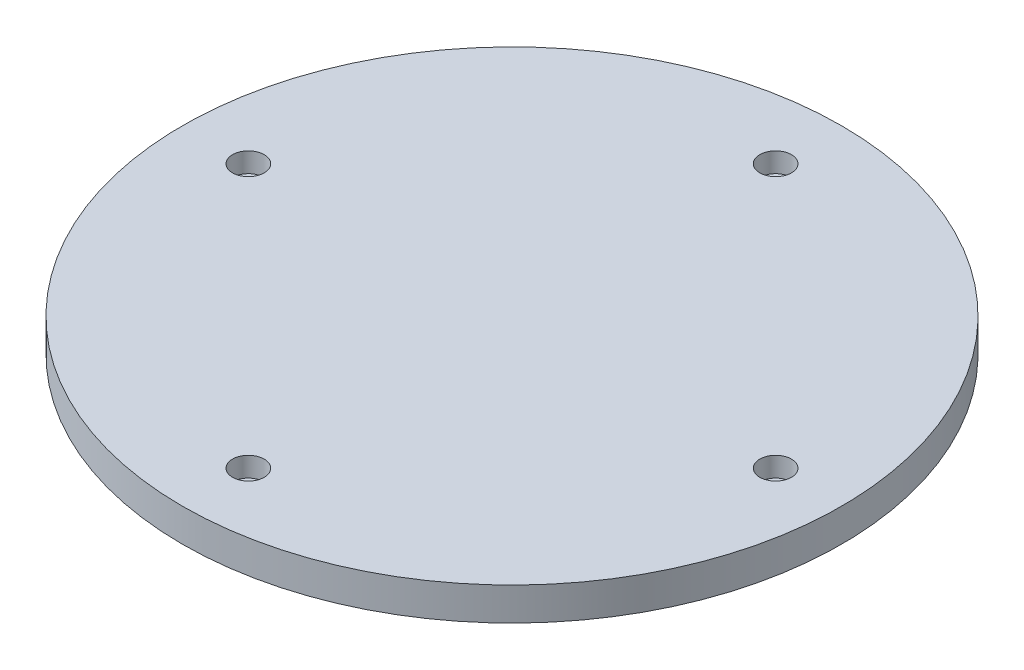
ISO-10303-21;
HEADER;
FILE_DESCRIPTION(('STEP AP214'),'2;1');
FILE_NAME('part.step','',(''),(''),'','','');
FILE_SCHEMA(('AUTOMOTIVE_DESIGN { 1 0 10303 214 1 1 1 1 }'));
ENDSEC;
DATA;
#1=APPLICATION_CONTEXT('core data for automotive mechanical design processes');
#2=APPLICATION_PROTOCOL_DEFINITION('international standard','automotive_design',2000,#1);
#3=PRODUCT_CONTEXT('',#1,'mechanical');
#4=PRODUCT('Part','Part','',(#3));
#5=PRODUCT_RELATED_PRODUCT_CATEGORY('part','',(#4));
#6=PRODUCT_DEFINITION_FORMATION('','',#4);
#7=PRODUCT_DEFINITION_CONTEXT('part definition',#1,'design');
#8=PRODUCT_DEFINITION('design','',#6,#7);
#9=PRODUCT_DEFINITION_SHAPE('','',#8);
#10=(LENGTH_UNIT() NAMED_UNIT(*) SI_UNIT(.MILLI.,.METRE.));
#11=(NAMED_UNIT(*) PLANE_ANGLE_UNIT() SI_UNIT($,.RADIAN.));
#12=(NAMED_UNIT(*) SI_UNIT($,.STERADIAN.) SOLID_ANGLE_UNIT());
#13=UNCERTAINTY_MEASURE_WITH_UNIT(LENGTH_MEASURE(1.E-05),#10,'distance_accuracy_value','');
#14=(GEOMETRIC_REPRESENTATION_CONTEXT(3) GLOBAL_UNCERTAINTY_ASSIGNED_CONTEXT((#13)) GLOBAL_UNIT_ASSIGNED_CONTEXT((#10,
#11,#12)) REPRESENTATION_CONTEXT('',''));
#15=CARTESIAN_POINT('',(0.,0.,0.));
#16=DIRECTION('',(0.,0.,1.));
#17=DIRECTION('',(1.,0.,0.));
#18=AXIS2_PLACEMENT_3D('',#15,#16,#17);
#19=CARTESIAN_POINT('',(0.,5.,0.));
#20=DIRECTION('',(0.,-1.,0.));
#21=DIRECTION('',(0.,0.,-1.));
#22=AXIS2_PLACEMENT_3D('',#19,#20,#21);
#23=CYLINDRICAL_SURFACE('',#22,50.);
#24=CARTESIAN_POINT('',(0.,5.,0.));
#25=DIRECTION('',(0.,1.,0.));
#26=DIRECTION('',(0.,0.,1.));
#27=AXIS2_PLACEMENT_3D('',#24,#25,#26);
#28=CIRCLE('',#27,50.);
#29=CARTESIAN_POINT('',(0.,5.,50.));
#30=VERTEX_POINT('',#29);
#31=EDGE_CURVE('E10',#30,#30,#28,.T.);
#32=ORIENTED_EDGE('',*,*,#31,.F.);
#33=EDGE_LOOP('',(#32));
#34=FACE_BOUND('',#33,.T.);
#35=CARTESIAN_POINT('',(0.,0.,0.));
#36=DIRECTION('',(0.,1.,0.));
#37=DIRECTION('',(0.,0.,1.));
#38=AXIS2_PLACEMENT_3D('',#35,#36,#37);
#39=CIRCLE('',#38,50.);
#40=CARTESIAN_POINT('',(0.,0.,50.));
#41=VERTEX_POINT('',#40);
#42=EDGE_CURVE('E38',#41,#41,#39,.T.);
#43=ORIENTED_EDGE('',*,*,#42,.T.);
#44=EDGE_LOOP('',(#43));
#45=FACE_BOUND('',#44,.T.);
#46=ADVANCED_FACE('F35',(#34,#45),#23,.T.);
#47=CARTESIAN_POINT('',(0.,5.,0.));
#48=DIRECTION('',(0.,1.,0.));
#49=DIRECTION('',(0.,0.,1.));
#50=AXIS2_PLACEMENT_3D('',#47,#48,#49);
#51=PLANE('',#50);
#52=CARTESIAN_POINT('',(0.,5.,-40.));
#53=DIRECTION('',(0.,1.,0.));
#54=DIRECTION('',(0.,0.,1.));
#55=AXIS2_PLACEMENT_3D('',#52,#53,#54);
#56=CIRCLE('',#55,2.4);
#57=CARTESIAN_POINT('',(0.,5.,-37.6));
#58=VERTEX_POINT('',#57);
#59=EDGE_CURVE('E101',#58,#58,#56,.T.);
#60=ORIENTED_EDGE('',*,*,#59,.F.);
#61=EDGE_LOOP('',(#60));
#62=FACE_BOUND('',#61,.T.);
#63=CARTESIAN_POINT('',(40.0000000000011,5.,-1.12952049642128E-12));
#64=DIRECTION('',(0.,1.,0.));
#65=DIRECTION('',(0.,0.,1.));
#66=AXIS2_PLACEMENT_3D('',#63,#64,#65);
#67=CIRCLE('',#66,2.40000000000088);
#68=CARTESIAN_POINT('',(40.0000000000011,5.,2.39999999999975));
#69=VERTEX_POINT('',#68);
#70=EDGE_CURVE('E98',#69,#69,#67,.T.);
#71=ORIENTED_EDGE('',*,*,#70,.F.);
#72=EDGE_LOOP('',(#71));
#73=FACE_BOUND('',#72,.T.);
#74=CARTESIAN_POINT('',(2.25904099284255E-12,5.,40.));
#75=DIRECTION('',(0.,1.,0.));
#76=DIRECTION('',(0.,0.,1.));
#77=AXIS2_PLACEMENT_3D('',#74,#75,#76);
#78=CIRCLE('',#77,2.40000000000243);
#79=CARTESIAN_POINT('',(2.25904099284255E-12,5.,42.4000000000024));
#80=VERTEX_POINT('',#79);
#81=EDGE_CURVE('E92',#80,#80,#78,.T.);
#82=ORIENTED_EDGE('',*,*,#81,.F.);
#83=EDGE_LOOP('',(#82));
#84=FACE_BOUND('',#83,.T.);
#85=CARTESIAN_POINT('',(-39.9999999999989,5.,1.13441908361787E-12));
#86=DIRECTION('',(0.,1.,0.));
#87=DIRECTION('',(0.,0.,1.));
#88=AXIS2_PLACEMENT_3D('',#85,#86,#87);
#89=CIRCLE('',#88,2.40000000000181);
#90=CARTESIAN_POINT('',(-39.9999999999989,5.,2.40000000000295));
#91=VERTEX_POINT('',#90);
#92=EDGE_CURVE('E86',#91,#91,#89,.T.);
#93=ORIENTED_EDGE('',*,*,#92,.F.);
#94=EDGE_LOOP('',(#93));
#95=FACE_BOUND('',#94,.T.);
#96=ORIENTED_EDGE('',*,*,#31,.T.);
#97=EDGE_LOOP('',(#96));
#98=FACE_BOUND('',#97,.T.);
#99=ADVANCED_FACE('F116',(#62,#73,#84,#95,#98),#51,.T.);
#100=CARTESIAN_POINT('',(0.,0.,0.));
#101=DIRECTION('',(0.,1.,0.));
#102=DIRECTION('',(0.,0.,1.));
#103=AXIS2_PLACEMENT_3D('',#100,#101,#102);
#104=PLANE('',#103);
#105=CARTESIAN_POINT('',(-8.00000000000014,0.,13.8564064605505));
#106=DIRECTION('',(0.,-1.,0.));
#107=DIRECTION('',(0.,0.,-1.));
#108=AXIS2_PLACEMENT_3D('',#105,#106,#107);
#109=CIRCLE('',#108,2.25);
#110=CARTESIAN_POINT('',(-8.00000000000014,0.,11.6064064605505));
#111=VERTEX_POINT('',#110);
#112=EDGE_CURVE('E56',#111,#111,#109,.T.);
#113=ORIENTED_EDGE('',*,*,#112,.F.);
#114=EDGE_LOOP('',(#113));
#115=FACE_BOUND('',#114,.T.);
#116=CARTESIAN_POINT('',(-15.9999999999996,0.,-8.38426233764199E-13));
#117=DIRECTION('',(0.,-1.,0.));
#118=DIRECTION('',(0.,0.,-1.));
#119=AXIS2_PLACEMENT_3D('',#116,#117,#118);
#120=CIRCLE('',#119,2.25);
#121=CARTESIAN_POINT('',(-15.9999999999996,0.,-2.25000000000084));
#122=VERTEX_POINT('',#121);
#123=EDGE_CURVE('E63',#122,#122,#120,.T.);
#124=ORIENTED_EDGE('',*,*,#123,.F.);
#125=EDGE_LOOP('',(#124));
#126=FACE_BOUND('',#125,.T.);
#127=CARTESIAN_POINT('',(-7.99999999999908,0.,-13.8564064605515));
#128=DIRECTION('',(0.,-1.,0.));
#129=DIRECTION('',(0.,0.,-1.));
#130=AXIS2_PLACEMENT_3D('',#127,#128,#129);
#131=CIRCLE('',#130,2.25);
#132=CARTESIAN_POINT('',(-7.99999999999908,0.,-16.1064064605515));
#133=VERTEX_POINT('',#132);
#134=EDGE_CURVE('E69',#133,#133,#131,.T.);
#135=ORIENTED_EDGE('',*,*,#134,.F.);
#136=EDGE_LOOP('',(#135));
#137=FACE_BOUND('',#136,.T.);
#138=CARTESIAN_POINT('',(8.00000000000092,0.,-13.8564064605509));
#139=DIRECTION('',(0.,-1.,0.));
#140=DIRECTION('',(0.,0.,-1.));
#141=AXIS2_PLACEMENT_3D('',#138,#139,#140);
#142=CIRCLE('',#141,2.25);
#143=CARTESIAN_POINT('',(8.00000000000092,0.,-16.1064064605509));
#144=VERTEX_POINT('',#143);
#145=EDGE_CURVE('E75',#144,#144,#142,.T.);
#146=ORIENTED_EDGE('',*,*,#145,.F.);
#147=EDGE_LOOP('',(#146));
#148=FACE_BOUND('',#147,.T.);
#149=CARTESIAN_POINT('',(16.0000000000004,0.,3.85036197768957E-13));
#150=DIRECTION('',(0.,-1.,0.));
#151=DIRECTION('',(0.,0.,-1.));
#152=AXIS2_PLACEMENT_3D('',#149,#150,#151);
#153=CIRCLE('',#152,2.25);
#154=CARTESIAN_POINT('',(16.0000000000004,0.,-2.24999999999961));
#155=VERTEX_POINT('',#154);
#156=EDGE_CURVE('E50',#155,#155,#153,.T.);
#157=ORIENTED_EDGE('',*,*,#156,.F.);
#158=EDGE_LOOP('',(#157));
#159=FACE_BOUND('',#158,.T.);
#160=CARTESIAN_POINT('',(7.99999999999987,0.,13.8564064605511));
#161=DIRECTION('',(0.,-1.,0.));
#162=DIRECTION('',(0.,0.,-1.));
#163=AXIS2_PLACEMENT_3D('',#160,#161,#162);
#164=CIRCLE('',#163,2.25);
#165=CARTESIAN_POINT('',(7.99999999999987,0.,11.6064064605511));
#166=VERTEX_POINT('',#165);
#167=EDGE_CURVE('E47',#166,#166,#164,.T.);
#168=ORIENTED_EDGE('',*,*,#167,.F.);
#169=EDGE_LOOP('',(#168));
#170=FACE_BOUND('',#169,.T.);
#171=ORIENTED_EDGE('',*,*,#42,.F.);
#172=EDGE_LOOP('',(#171));
#173=FACE_BOUND('',#172,.T.);
#174=ADVANCED_FACE('F119',(#115,#126,#137,#148,#159,#170,#173),#104,.F.);
#175=CARTESIAN_POINT('',(7.99999999999987,3.,13.8564064605511));
#176=DIRECTION('',(0.,-1.,0.));
#177=DIRECTION('',(0.,0.,-1.));
#178=AXIS2_PLACEMENT_3D('',#175,#176,#177);
#179=CYLINDRICAL_SURFACE('',#178,2.25);
#180=CARTESIAN_POINT('',(7.99999999999987,3.,13.8564064605511));
#181=DIRECTION('',(0.,-1.,0.));
#182=DIRECTION('',(0.,0.,-1.));
#183=AXIS2_PLACEMENT_3D('',#180,#181,#182);
#184=CIRCLE('',#183,2.25);
#185=CARTESIAN_POINT('',(7.99999999999987,3.,11.6064064605511));
#186=VERTEX_POINT('',#185);
#187=EDGE_CURVE('E45',#186,#186,#184,.T.);
#188=ORIENTED_EDGE('',*,*,#187,.F.);
#189=EDGE_LOOP('',(#188));
#190=FACE_BOUND('',#189,.T.);
#191=ORIENTED_EDGE('',*,*,#167,.T.);
#192=EDGE_LOOP('',(#191));
#193=FACE_BOUND('',#192,.T.);
#194=ADVANCED_FACE('F154',(#190,#193),#179,.F.);
#195=CARTESIAN_POINT('',(7.99999999999987,3.,13.8564064605511));
#196=DIRECTION('',(0.,-1.,0.));
#197=DIRECTION('',(0.,0.,-1.));
#198=AXIS2_PLACEMENT_3D('',#195,#196,#197);
#199=PLANE('',#198);
#200=ORIENTED_EDGE('',*,*,#187,.T.);
#201=EDGE_LOOP('',(#200));
#202=FACE_BOUND('',#201,.T.);
#203=ADVANCED_FACE('F160',(#202),#199,.T.);
#204=CARTESIAN_POINT('',(16.0000000000004,3.,3.85036197768957E-13));
#205=DIRECTION('',(0.,-1.,0.));
#206=DIRECTION('',(0.,0.,-1.));
#207=AXIS2_PLACEMENT_3D('',#204,#205,#206);
#208=CYLINDRICAL_SURFACE('',#207,2.25);
#209=CARTESIAN_POINT('',(16.0000000000004,3.,3.85036197768957E-13));
#210=DIRECTION('',(0.,-1.,0.));
#211=DIRECTION('',(0.,0.,-1.));
#212=AXIS2_PLACEMENT_3D('',#209,#210,#211);
#213=CIRCLE('',#212,2.25);
#214=CARTESIAN_POINT('',(16.0000000000004,3.,-2.24999999999961));
#215=VERTEX_POINT('',#214);
#216=EDGE_CURVE('E78',#215,#215,#213,.T.);
#217=ORIENTED_EDGE('',*,*,#216,.F.);
#218=EDGE_LOOP('',(#217));
#219=FACE_BOUND('',#218,.T.);
#220=ORIENTED_EDGE('',*,*,#156,.T.);
#221=EDGE_LOOP('',(#220));
#222=FACE_BOUND('',#221,.T.);
#223=ADVANCED_FACE('F167',(#219,#222),#208,.F.);
#224=CARTESIAN_POINT('',(16.0000000000004,3.,3.85036197768957E-13));
#225=DIRECTION('',(0.,-1.,0.));
#226=DIRECTION('',(0.,0.,-1.));
#227=AXIS2_PLACEMENT_3D('',#224,#225,#226);
#228=PLANE('',#227);
#229=ORIENTED_EDGE('',*,*,#216,.T.);
#230=EDGE_LOOP('',(#229));
#231=FACE_BOUND('',#230,.T.);
#232=ADVANCED_FACE('F196',(#231),#228,.T.);
#233=CARTESIAN_POINT('',(8.00000000000092,3.,-13.8564064605509));
#234=DIRECTION('',(0.,-1.,0.));
#235=DIRECTION('',(0.,0.,-1.));
#236=AXIS2_PLACEMENT_3D('',#233,#234,#235);
#237=CYLINDRICAL_SURFACE('',#236,2.25);
#238=CARTESIAN_POINT('',(8.00000000000092,3.,-13.8564064605509));
#239=DIRECTION('',(0.,-1.,0.));
#240=DIRECTION('',(0.,0.,-1.));
#241=AXIS2_PLACEMENT_3D('',#238,#239,#240);
#242=CIRCLE('',#241,2.25);
#243=CARTESIAN_POINT('',(8.00000000000092,3.,-16.1064064605509));
#244=VERTEX_POINT('',#243);
#245=EDGE_CURVE('E72',#244,#244,#242,.T.);
#246=ORIENTED_EDGE('',*,*,#245,.F.);
#247=EDGE_LOOP('',(#246));
#248=FACE_BOUND('',#247,.T.);
#249=ORIENTED_EDGE('',*,*,#145,.T.);
#250=EDGE_LOOP('',(#249));
#251=FACE_BOUND('',#250,.T.);
#252=ADVANCED_FACE('F192',(#248,#251),#237,.F.);
#253=CARTESIAN_POINT('',(8.00000000000092,3.,-13.8564064605509));
#254=DIRECTION('',(0.,-1.,0.));
#255=DIRECTION('',(0.,0.,-1.));
#256=AXIS2_PLACEMENT_3D('',#253,#254,#255);
#257=PLANE('',#256);
#258=ORIENTED_EDGE('',*,*,#245,.T.);
#259=EDGE_LOOP('',(#258));
#260=FACE_BOUND('',#259,.T.);
#261=ADVANCED_FACE('F188',(#260),#257,.T.);
#262=CARTESIAN_POINT('',(-7.99999999999908,3.,-13.8564064605515));
#263=DIRECTION('',(0.,-1.,0.));
#264=DIRECTION('',(0.,0.,-1.));
#265=AXIS2_PLACEMENT_3D('',#262,#263,#264);
#266=CYLINDRICAL_SURFACE('',#265,2.25);
#267=CARTESIAN_POINT('',(-7.99999999999908,3.,-13.8564064605515));
#268=DIRECTION('',(0.,-1.,0.));
#269=DIRECTION('',(0.,0.,-1.));
#270=AXIS2_PLACEMENT_3D('',#267,#268,#269);
#271=CIRCLE('',#270,2.25);
#272=CARTESIAN_POINT('',(-7.99999999999908,3.,-16.1064064605515));
#273=VERTEX_POINT('',#272);
#274=EDGE_CURVE('E66',#273,#273,#271,.T.);
#275=ORIENTED_EDGE('',*,*,#274,.F.);
#276=EDGE_LOOP('',(#275));
#277=FACE_BOUND('',#276,.T.);
#278=ORIENTED_EDGE('',*,*,#134,.T.);
#279=EDGE_LOOP('',(#278));
#280=FACE_BOUND('',#279,.T.);
#281=ADVANCED_FACE('F184',(#277,#280),#266,.F.);
#282=CARTESIAN_POINT('',(-7.99999999999908,3.,-13.8564064605515));
#283=DIRECTION('',(0.,-1.,0.));
#284=DIRECTION('',(0.,0.,-1.));
#285=AXIS2_PLACEMENT_3D('',#282,#283,#284);
#286=PLANE('',#285);
#287=ORIENTED_EDGE('',*,*,#274,.T.);
#288=EDGE_LOOP('',(#287));
#289=FACE_BOUND('',#288,.T.);
#290=ADVANCED_FACE('F180',(#289),#286,.T.);
#291=CARTESIAN_POINT('',(-15.9999999999996,3.,-8.38426233764199E-13));
#292=DIRECTION('',(0.,-1.,0.));
#293=DIRECTION('',(0.,0.,-1.));
#294=AXIS2_PLACEMENT_3D('',#291,#292,#293);
#295=CYLINDRICAL_SURFACE('',#294,2.25);
#296=CARTESIAN_POINT('',(-15.9999999999996,3.,-8.38426233764199E-13));
#297=DIRECTION('',(0.,-1.,0.));
#298=DIRECTION('',(0.,0.,-1.));
#299=AXIS2_PLACEMENT_3D('',#296,#297,#298);
#300=CIRCLE('',#299,2.25);
#301=CARTESIAN_POINT('',(-15.9999999999996,3.,-2.25000000000084));
#302=VERTEX_POINT('',#301);
#303=EDGE_CURVE('E60',#302,#302,#300,.T.);
#304=ORIENTED_EDGE('',*,*,#303,.F.);
#305=EDGE_LOOP('',(#304));
#306=FACE_BOUND('',#305,.T.);
#307=ORIENTED_EDGE('',*,*,#123,.T.);
#308=EDGE_LOOP('',(#307));
#309=FACE_BOUND('',#308,.T.);
#310=ADVANCED_FACE('F176',(#306,#309),#295,.F.);
#311=CARTESIAN_POINT('',(-15.9999999999996,3.,-8.38426233764199E-13));
#312=DIRECTION('',(0.,-1.,0.));
#313=DIRECTION('',(0.,0.,-1.));
#314=AXIS2_PLACEMENT_3D('',#311,#312,#313);
#315=PLANE('',#314);
#316=ORIENTED_EDGE('',*,*,#303,.T.);
#317=EDGE_LOOP('',(#316));
#318=FACE_BOUND('',#317,.T.);
#319=ADVANCED_FACE('F172',(#318),#315,.T.);
#320=CARTESIAN_POINT('',(-8.00000000000014,3.,13.8564064605505));
#321=DIRECTION('',(0.,-1.,0.));
#322=DIRECTION('',(0.,0.,-1.));
#323=AXIS2_PLACEMENT_3D('',#320,#321,#322);
#324=CYLINDRICAL_SURFACE('',#323,2.25);
#325=CARTESIAN_POINT('',(-8.00000000000014,3.,13.8564064605505));
#326=DIRECTION('',(0.,-1.,0.));
#327=DIRECTION('',(0.,0.,-1.));
#328=AXIS2_PLACEMENT_3D('',#325,#326,#327);
#329=CIRCLE('',#328,2.25);
#330=CARTESIAN_POINT('',(-8.00000000000014,3.,11.6064064605505));
#331=VERTEX_POINT('',#330);
#332=EDGE_CURVE('E53',#331,#331,#329,.T.);
#333=ORIENTED_EDGE('',*,*,#332,.F.);
#334=EDGE_LOOP('',(#333));
#335=FACE_BOUND('',#334,.T.);
#336=ORIENTED_EDGE('',*,*,#112,.T.);
#337=EDGE_LOOP('',(#336));
#338=FACE_BOUND('',#337,.T.);
#339=ADVANCED_FACE('F140',(#335,#338),#324,.F.);
#340=CARTESIAN_POINT('',(-8.00000000000014,3.,13.8564064605505));
#341=DIRECTION('',(0.,-1.,0.));
#342=DIRECTION('',(0.,0.,-1.));
#343=AXIS2_PLACEMENT_3D('',#340,#341,#342);
#344=PLANE('',#343);
#345=ORIENTED_EDGE('',*,*,#332,.T.);
#346=EDGE_LOOP('',(#345));
#347=FACE_BOUND('',#346,.T.);
#348=ADVANCED_FACE('F130',(#347),#344,.T.);
#349=CARTESIAN_POINT('',(-39.9999999999989,2.,1.13441908361787E-12));
#350=DIRECTION('',(0.,1.,0.));
#351=DIRECTION('',(0.,0.,1.));
#352=AXIS2_PLACEMENT_3D('',#349,#350,#351);
#353=CYLINDRICAL_SURFACE('',#352,2.40000000000181);
#354=CARTESIAN_POINT('',(-39.9999999999989,2.,1.13441908361787E-12));
#355=DIRECTION('',(0.,1.,0.));
#356=DIRECTION('',(0.,0.,1.));
#357=AXIS2_PLACEMENT_3D('',#354,#355,#356);
#358=CIRCLE('',#357,2.40000000000181);
#359=CARTESIAN_POINT('',(-39.9999999999989,2.,2.40000000000295));
#360=VERTEX_POINT('',#359);
#361=EDGE_CURVE('E83',#360,#360,#358,.T.);
#362=ORIENTED_EDGE('',*,*,#361,.F.);
#363=EDGE_LOOP('',(#362));
#364=FACE_BOUND('',#363,.T.);
#365=ORIENTED_EDGE('',*,*,#92,.T.);
#366=EDGE_LOOP('',(#365));
#367=FACE_BOUND('',#366,.T.);
#368=ADVANCED_FACE('F127',(#364,#367),#353,.F.);
#369=CARTESIAN_POINT('',(-39.9999999999989,2.,1.13441908361787E-12));
#370=DIRECTION('',(0.,1.,0.));
#371=DIRECTION('',(0.,0.,1.));
#372=AXIS2_PLACEMENT_3D('',#369,#370,#371);
#373=PLANE('',#372);
#374=ORIENTED_EDGE('',*,*,#361,.T.);
#375=EDGE_LOOP('',(#374));
#376=FACE_BOUND('',#375,.T.);
#377=ADVANCED_FACE('F129',(#376),#373,.T.);
#378=CARTESIAN_POINT('',(2.25904099284255E-12,2.,40.));
#379=DIRECTION('',(0.,1.,0.));
#380=DIRECTION('',(0.,0.,1.));
#381=AXIS2_PLACEMENT_3D('',#378,#379,#380);
#382=CYLINDRICAL_SURFACE('',#381,2.40000000000243);
#383=CARTESIAN_POINT('',(2.25904099284255E-12,2.,40.));
#384=DIRECTION('',(0.,1.,0.));
#385=DIRECTION('',(0.,0.,1.));
#386=AXIS2_PLACEMENT_3D('',#383,#384,#385);
#387=CIRCLE('',#386,2.40000000000243);
#388=CARTESIAN_POINT('',(2.25904099284255E-12,2.,42.4000000000024));
#389=VERTEX_POINT('',#388);
#390=EDGE_CURVE('E89',#389,#389,#387,.T.);
#391=ORIENTED_EDGE('',*,*,#390,.F.);
#392=EDGE_LOOP('',(#391));
#393=FACE_BOUND('',#392,.T.);
#394=ORIENTED_EDGE('',*,*,#81,.T.);
#395=EDGE_LOOP('',(#394));
#396=FACE_BOUND('',#395,.T.);
#397=ADVANCED_FACE('F137',(#393,#396),#382,.F.);
#398=CARTESIAN_POINT('',(2.25904099284255E-12,2.,40.));
#399=DIRECTION('',(0.,1.,0.));
#400=DIRECTION('',(0.,0.,1.));
#401=AXIS2_PLACEMENT_3D('',#398,#399,#400);
#402=PLANE('',#401);
#403=ORIENTED_EDGE('',*,*,#390,.T.);
#404=EDGE_LOOP('',(#403));
#405=FACE_BOUND('',#404,.T.);
#406=ADVANCED_FACE('F275',(#405),#402,.T.);
#407=CARTESIAN_POINT('',(40.0000000000011,2.,-1.12952049642128E-12));
#408=DIRECTION('',(0.,1.,0.));
#409=DIRECTION('',(0.,0.,1.));
#410=AXIS2_PLACEMENT_3D('',#407,#408,#409);
#411=CYLINDRICAL_SURFACE('',#410,2.40000000000088);
#412=CARTESIAN_POINT('',(40.0000000000011,2.,-1.12952049642128E-12));
#413=DIRECTION('',(0.,1.,0.));
#414=DIRECTION('',(0.,0.,1.));
#415=AXIS2_PLACEMENT_3D('',#412,#413,#414);
#416=CIRCLE('',#415,2.40000000000088);
#417=CARTESIAN_POINT('',(40.0000000000011,2.,2.39999999999975));
#418=VERTEX_POINT('',#417);
#419=EDGE_CURVE('E95',#418,#418,#416,.T.);
#420=ORIENTED_EDGE('',*,*,#419,.F.);
#421=EDGE_LOOP('',(#420));
#422=FACE_BOUND('',#421,.T.);
#423=ORIENTED_EDGE('',*,*,#70,.T.);
#424=EDGE_LOOP('',(#423));
#425=FACE_BOUND('',#424,.T.);
#426=ADVANCED_FACE('F286',(#422,#425),#411,.F.);
#427=CARTESIAN_POINT('',(40.0000000000011,2.,-1.12952049642128E-12));
#428=DIRECTION('',(0.,1.,0.));
#429=DIRECTION('',(0.,0.,1.));
#430=AXIS2_PLACEMENT_3D('',#427,#428,#429);
#431=PLANE('',#430);
#432=ORIENTED_EDGE('',*,*,#419,.T.);
#433=EDGE_LOOP('',(#432));
#434=FACE_BOUND('',#433,.T.);
#435=ADVANCED_FACE('F112',(#434),#431,.T.);
#436=CARTESIAN_POINT('',(0.,2.,-40.));
#437=DIRECTION('',(0.,1.,0.));
#438=DIRECTION('',(0.,0.,1.));
#439=AXIS2_PLACEMENT_3D('',#436,#437,#438);
#440=CYLINDRICAL_SURFACE('',#439,2.4);
#441=CARTESIAN_POINT('',(0.,2.,-40.));
#442=DIRECTION('',(0.,1.,0.));
#443=DIRECTION('',(0.,0.,1.));
#444=AXIS2_PLACEMENT_3D('',#441,#442,#443);
#445=CIRCLE('',#444,2.4);
#446=CARTESIAN_POINT('',(0.,2.,-37.6));
#447=VERTEX_POINT('',#446);
#448=EDGE_CURVE('E57',#447,#447,#445,.T.);
#449=ORIENTED_EDGE('',*,*,#448,.F.);
#450=EDGE_LOOP('',(#449));
#451=FACE_BOUND('',#450,.T.);
#452=ORIENTED_EDGE('',*,*,#59,.T.);
#453=EDGE_LOOP('',(#452));
#454=FACE_BOUND('',#453,.T.);
#455=ADVANCED_FACE('F109',(#451,#454),#440,.F.);
#456=CARTESIAN_POINT('',(0.,2.,-40.));
#457=DIRECTION('',(0.,1.,0.));
#458=DIRECTION('',(0.,0.,1.));
#459=AXIS2_PLACEMENT_3D('',#456,#457,#458);
#460=PLANE('',#459);
#461=ORIENTED_EDGE('',*,*,#448,.T.);
#462=EDGE_LOOP('',(#461));
#463=FACE_BOUND('',#462,.T.);
#464=ADVANCED_FACE('F107',(#463),#460,.T.);
#465=CLOSED_SHELL('',(#46,#99,#174,#194,#203,#223,#232,#252,#261,#281,#290,#310,#319,#339,#348,
#368,#377,#397,#406,#426,#435,#455,#464));
#466=MANIFOLD_SOLID_BREP('B2',#465);
#467=ADVANCED_BREP_SHAPE_REPRESENTATION('',(#18,#466),#14);
#468=SHAPE_DEFINITION_REPRESENTATION(#9,#467);
ENDSEC;
END-ISO-10303-21;
